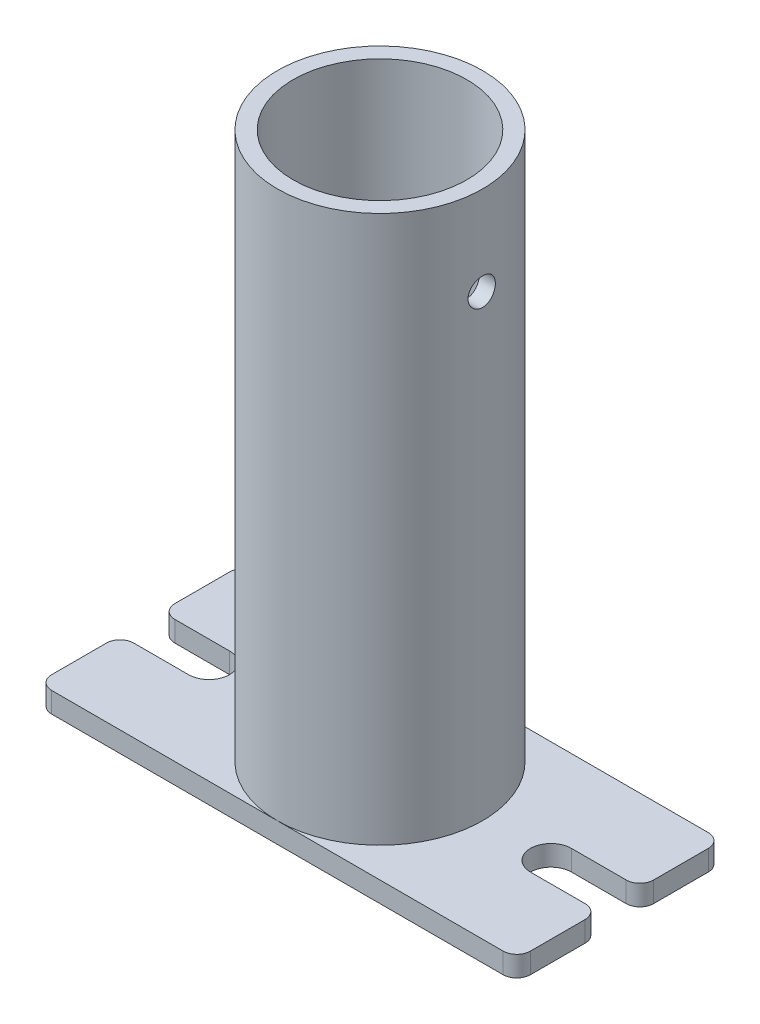
ISO-10303-21;
HEADER;
FILE_DESCRIPTION(('STEP AP214'),'2;1');
FILE_NAME('part.step','',(''),(''),'','','');
FILE_SCHEMA(('AUTOMOTIVE_DESIGN { 1 0 10303 214 1 1 1 1 }'));
ENDSEC;
DATA;
#1=APPLICATION_CONTEXT('core data for automotive mechanical design processes');
#2=APPLICATION_PROTOCOL_DEFINITION('international standard','automotive_design',2000,#1);
#3=PRODUCT_CONTEXT('',#1,'mechanical');
#4=PRODUCT('Part','Part','',(#3));
#5=PRODUCT_RELATED_PRODUCT_CATEGORY('part','',(#4));
#6=PRODUCT_DEFINITION_FORMATION('','',#4);
#7=PRODUCT_DEFINITION_CONTEXT('part definition',#1,'design');
#8=PRODUCT_DEFINITION('design','',#6,#7);
#9=PRODUCT_DEFINITION_SHAPE('','',#8);
#10=(LENGTH_UNIT() NAMED_UNIT(*) SI_UNIT(.MILLI.,.METRE.));
#11=(NAMED_UNIT(*) PLANE_ANGLE_UNIT() SI_UNIT($,.RADIAN.));
#12=(NAMED_UNIT(*) SI_UNIT($,.STERADIAN.) SOLID_ANGLE_UNIT());
#13=UNCERTAINTY_MEASURE_WITH_UNIT(LENGTH_MEASURE(1.E-05),#10,'distance_accuracy_value','');
#14=(GEOMETRIC_REPRESENTATION_CONTEXT(3) GLOBAL_UNCERTAINTY_ASSIGNED_CONTEXT((#13)) GLOBAL_UNIT_ASSIGNED_CONTEXT((#10,
#11,#12)) REPRESENTATION_CONTEXT('',''));
#15=CARTESIAN_POINT('',(0.,0.,0.));
#16=DIRECTION('',(0.,0.,1.));
#17=DIRECTION('',(1.,0.,0.));
#18=AXIS2_PLACEMENT_3D('',#15,#16,#17);
#19=CARTESIAN_POINT('',(10.,3.,-15.));
#20=DIRECTION('',(0.,1.,0.));
#21=DIRECTION('',(0.,0.,1.));
#22=AXIS2_PLACEMENT_3D('',#19,#20,#21);
#23=PLANE('',#22);
#24=CARTESIAN_POINT('',(35.,3.,-15.));
#25=DIRECTION('',(0.,1.,0.));
#26=DIRECTION('',(0.,0.,1.));
#27=AXIS2_PLACEMENT_3D('',#24,#25,#26);
#28=CIRCLE('',#27,15.);
#29=CARTESIAN_POINT('',(35.,3.,0.));
#30=VERTEX_POINT('',#29);
#31=CARTESIAN_POINT('',(35.,3.,-30.));
#32=VERTEX_POINT('',#31);
#33=EDGE_CURVE('E236',#30,#32,#28,.T.);
#34=ORIENTED_EDGE('',*,*,#33,.F.);
#35=DIRECTION('',(1.,0.,0.));
#36=VECTOR('',#35,1.);
#37=CARTESIAN_POINT('',(2.00000000000001,3.,0.));
#38=LINE('',#37,#36);
#39=CARTESIAN_POINT('',(68.,3.,0.));
#40=VERTEX_POINT('',#39);
#41=EDGE_CURVE('E509',#30,#40,#38,.T.);
#42=ORIENTED_EDGE('',*,*,#41,.T.);
#43=CARTESIAN_POINT('',(68.,3.,-2.));
#44=DIRECTION('',(0.,1.,0.));
#45=DIRECTION('',(0.,0.,1.));
#46=AXIS2_PLACEMENT_3D('',#43,#44,#45);
#47=CIRCLE('',#46,2.);
#48=CARTESIAN_POINT('',(70.,3.,-2.00000000000001));
#49=VERTEX_POINT('',#48);
#50=EDGE_CURVE('E520',#40,#49,#47,.T.);
#51=ORIENTED_EDGE('',*,*,#50,.T.);
#52=DIRECTION('',(0.,0.,-1.));
#53=VECTOR('',#52,1.);
#54=CARTESIAN_POINT('',(70.,3.,-2.00000000000001));
#55=LINE('',#54,#53);
#56=CARTESIAN_POINT('',(70.,3.,-9.99999999999999));
#57=VERTEX_POINT('',#56);
#58=EDGE_CURVE('E523',#49,#57,#55,.T.);
#59=ORIENTED_EDGE('',*,*,#58,.T.);
#60=CARTESIAN_POINT('',(68.,3.,-10.));
#61=DIRECTION('',(0.,1.,0.));
#62=DIRECTION('',(0.,0.,-1.));
#63=AXIS2_PLACEMENT_3D('',#60,#61,#62);
#64=CIRCLE('',#63,2.);
#65=CARTESIAN_POINT('',(68.,3.,-12.));
#66=VERTEX_POINT('',#65);
#67=EDGE_CURVE('E526',#57,#66,#64,.T.);
#68=ORIENTED_EDGE('',*,*,#67,.T.);
#69=DIRECTION('',(-1.,0.,0.));
#70=VECTOR('',#69,1.);
#71=CARTESIAN_POINT('',(68.,3.,-12.));
#72=LINE('',#71,#70);
#73=CARTESIAN_POINT('',(60.,3.,-12.));
#74=VERTEX_POINT('',#73);
#75=EDGE_CURVE('E529',#66,#74,#72,.T.);
#76=ORIENTED_EDGE('',*,*,#75,.T.);
#77=CARTESIAN_POINT('',(60.,3.,-15.));
#78=DIRECTION('',(0.,-1.,0.));
#79=DIRECTION('',(0.,0.,1.));
#80=AXIS2_PLACEMENT_3D('',#77,#78,#79);
#81=CIRCLE('',#80,3.);
#82=CARTESIAN_POINT('',(60.,3.,-18.));
#83=VERTEX_POINT('',#82);
#84=EDGE_CURVE('E532',#74,#83,#81,.T.);
#85=ORIENTED_EDGE('',*,*,#84,.T.);
#86=DIRECTION('',(1.,0.,0.));
#87=VECTOR('',#86,1.);
#88=CARTESIAN_POINT('',(68.,3.,-18.));
#89=LINE('',#88,#87);
#90=CARTESIAN_POINT('',(68.,3.,-18.));
#91=VERTEX_POINT('',#90);
#92=EDGE_CURVE('E535',#83,#91,#89,.T.);
#93=ORIENTED_EDGE('',*,*,#92,.T.);
#94=CARTESIAN_POINT('',(68.,3.,-20.));
#95=DIRECTION('',(0.,1.,0.));
#96=DIRECTION('',(0.,0.,1.));
#97=AXIS2_PLACEMENT_3D('',#94,#95,#96);
#98=CIRCLE('',#97,2.);
#99=CARTESIAN_POINT('',(70.,3.,-20.));
#100=VERTEX_POINT('',#99);
#101=EDGE_CURVE('E538',#91,#100,#98,.T.);
#102=ORIENTED_EDGE('',*,*,#101,.T.);
#103=DIRECTION('',(0.,0.,-1.));
#104=VECTOR('',#103,1.);
#105=CARTESIAN_POINT('',(70.,3.,-20.));
#106=LINE('',#105,#104);
#107=CARTESIAN_POINT('',(70.,3.,-28.));
#108=VERTEX_POINT('',#107);
#109=EDGE_CURVE('E541',#100,#108,#106,.T.);
#110=ORIENTED_EDGE('',*,*,#109,.T.);
#111=CARTESIAN_POINT('',(68.,3.,-28.));
#112=DIRECTION('',(0.,1.,0.));
#113=DIRECTION('',(0.,0.,-1.));
#114=AXIS2_PLACEMENT_3D('',#111,#112,#113);
#115=CIRCLE('',#114,2.);
#116=CARTESIAN_POINT('',(68.,3.,-30.));
#117=VERTEX_POINT('',#116);
#118=EDGE_CURVE('E544',#108,#117,#115,.T.);
#119=ORIENTED_EDGE('',*,*,#118,.T.);
#120=DIRECTION('',(-1.,0.,0.));
#121=VECTOR('',#120,1.);
#122=CARTESIAN_POINT('',(2.00000000000001,3.,-30.));
#123=LINE('',#122,#121);
#124=EDGE_CURVE('E548',#117,#32,#123,.T.);
#125=ORIENTED_EDGE('',*,*,#124,.T.);
#126=EDGE_LOOP('',(#34,#42,#51,#59,#68,#76,#85,#93,#102,#110,#119,#125));
#127=FACE_BOUND('',#126,.T.);
#128=ADVANCED_FACE('F43',(#127),#23,.T.);
#129=CARTESIAN_POINT('',(10.,3.,-15.));
#130=DIRECTION('',(0.,-1.,0.));
#131=DIRECTION('',(0.,0.,-1.));
#132=AXIS2_PLACEMENT_3D('',#129,#130,#131);
#133=CYLINDRICAL_SURFACE('',#132,3.);
#134=CARTESIAN_POINT('',(10.,0.,-15.));
#135=DIRECTION('',(0.,-1.,0.));
#136=DIRECTION('',(0.,0.,1.));
#137=AXIS2_PLACEMENT_3D('',#134,#135,#136);
#138=CIRCLE('',#137,3.);
#139=CARTESIAN_POINT('',(10.,0.,-18.));
#140=VERTEX_POINT('',#139);
#141=CARTESIAN_POINT('',(10.,0.,-12.));
#142=VERTEX_POINT('',#141);
#143=EDGE_CURVE('E231',#140,#142,#138,.T.);
#144=ORIENTED_EDGE('',*,*,#143,.T.);
#145=DIRECTION('',(0.,-1.,0.));
#146=VECTOR('',#145,1.);
#147=CARTESIAN_POINT('',(10.,3.,-12.));
#148=LINE('',#147,#146);
#149=CARTESIAN_POINT('',(10.,3.,-12.));
#150=VERTEX_POINT('',#149);
#151=EDGE_CURVE('E358',#150,#142,#148,.T.);
#152=ORIENTED_EDGE('',*,*,#151,.F.);
#153=CARTESIAN_POINT('',(10.,3.,-15.));
#154=DIRECTION('',(0.,-1.,0.));
#155=DIRECTION('',(0.,0.,1.));
#156=AXIS2_PLACEMENT_3D('',#153,#154,#155);
#157=CIRCLE('',#156,3.);
#158=CARTESIAN_POINT('',(10.,3.,-18.));
#159=VERTEX_POINT('',#158);
#160=EDGE_CURVE('E291',#159,#150,#157,.T.);
#161=ORIENTED_EDGE('',*,*,#160,.F.);
#162=DIRECTION('',(0.,-1.,0.));
#163=VECTOR('',#162,1.);
#164=CARTESIAN_POINT('',(10.,3.,-18.));
#165=LINE('',#164,#163);
#166=EDGE_CURVE('E227',#159,#140,#165,.T.);
#167=ORIENTED_EDGE('',*,*,#166,.T.);
#168=EDGE_LOOP('',(#144,#152,#161,#167));
#169=FACE_BOUND('',#168,.T.);
#170=ADVANCED_FACE('F45',(#169),#133,.F.);
#171=CARTESIAN_POINT('',(2.00000000000001,3.,-12.));
#172=DIRECTION('',(0.,0.,1.));
#173=DIRECTION('',(1.,0.,0.));
#174=AXIS2_PLACEMENT_3D('',#171,#172,#173);
#175=PLANE('',#174);
#176=DIRECTION('',(-1.,0.,0.));
#177=VECTOR('',#176,1.);
#178=CARTESIAN_POINT('',(2.00000000000001,0.,-12.));
#179=LINE('',#178,#177);
#180=CARTESIAN_POINT('',(2.00000000000001,0.,-12.));
#181=VERTEX_POINT('',#180);
#182=EDGE_CURVE('E235',#142,#181,#179,.T.);
#183=ORIENTED_EDGE('',*,*,#182,.T.);
#184=DIRECTION('',(0.,-1.,0.));
#185=VECTOR('',#184,1.);
#186=CARTESIAN_POINT('',(2.00000000000001,3.,-12.));
#187=LINE('',#186,#185);
#188=CARTESIAN_POINT('',(2.00000000000001,3.,-12.));
#189=VERTEX_POINT('',#188);
#190=EDGE_CURVE('E354',#189,#181,#187,.T.);
#191=ORIENTED_EDGE('',*,*,#190,.F.);
#192=DIRECTION('',(-1.,0.,0.));
#193=VECTOR('',#192,1.);
#194=CARTESIAN_POINT('',(2.00000000000001,3.,-12.));
#195=LINE('',#194,#193);
#196=EDGE_CURVE('E150',#150,#189,#195,.T.);
#197=ORIENTED_EDGE('',*,*,#196,.F.);
#198=ORIENTED_EDGE('',*,*,#151,.T.);
#199=EDGE_LOOP('',(#183,#191,#197,#198));
#200=FACE_BOUND('',#199,.T.);
#201=ADVANCED_FACE('F413',(#200),#175,.F.);
#202=CARTESIAN_POINT('',(2.,3.,-10.));
#203=DIRECTION('',(0.,-1.,0.));
#204=DIRECTION('',(0.,0.,-1.));
#205=AXIS2_PLACEMENT_3D('',#202,#203,#204);
#206=CYLINDRICAL_SURFACE('',#205,2.);
#207=CARTESIAN_POINT('',(2.,0.,-10.));
#208=DIRECTION('',(0.,1.,0.));
#209=DIRECTION('',(0.,0.,1.));
#210=AXIS2_PLACEMENT_3D('',#207,#208,#209);
#211=CIRCLE('',#210,2.);
#212=CARTESIAN_POINT('',(0.,0.,-9.99999999999999));
#213=VERTEX_POINT('',#212);
#214=EDGE_CURVE('E239',#181,#213,#211,.T.);
#215=ORIENTED_EDGE('',*,*,#214,.T.);
#216=DIRECTION('',(0.,-1.,0.));
#217=VECTOR('',#216,1.);
#218=CARTESIAN_POINT('',(0.,3.,-9.99999999999999));
#219=LINE('',#218,#217);
#220=CARTESIAN_POINT('',(0.,3.,-9.99999999999999));
#221=VERTEX_POINT('',#220);
#222=EDGE_CURVE('E350',#221,#213,#219,.T.);
#223=ORIENTED_EDGE('',*,*,#222,.F.);
#224=CARTESIAN_POINT('',(2.,3.,-10.));
#225=DIRECTION('',(0.,1.,0.));
#226=DIRECTION('',(0.,0.,1.));
#227=AXIS2_PLACEMENT_3D('',#224,#225,#226);
#228=CIRCLE('',#227,2.);
#229=EDGE_CURVE('E498',#189,#221,#228,.T.);
#230=ORIENTED_EDGE('',*,*,#229,.F.);
#231=ORIENTED_EDGE('',*,*,#190,.T.);
#232=EDGE_LOOP('',(#215,#223,#230,#231));
#233=FACE_BOUND('',#232,.T.);
#234=ADVANCED_FACE('F487',(#233),#206,.T.);
#235=CARTESIAN_POINT('',(0.,3.,-2.00000000000001));
#236=DIRECTION('',(1.,0.,0.));
#237=DIRECTION('',(0.,0.,-1.));
#238=AXIS2_PLACEMENT_3D('',#235,#236,#237);
#239=PLANE('',#238);
#240=DIRECTION('',(0.,0.,1.));
#241=VECTOR('',#240,1.);
#242=CARTESIAN_POINT('',(0.,0.,-2.00000000000001));
#243=LINE('',#242,#241);
#244=CARTESIAN_POINT('',(0.,0.,-2.00000000000001));
#245=VERTEX_POINT('',#244);
#246=EDGE_CURVE('E242',#213,#245,#243,.T.);
#247=ORIENTED_EDGE('',*,*,#246,.T.);
#248=DIRECTION('',(0.,-1.,0.));
#249=VECTOR('',#248,1.);
#250=CARTESIAN_POINT('',(0.,3.,-2.00000000000001));
#251=LINE('',#250,#249);
#252=CARTESIAN_POINT('',(0.,3.,-2.00000000000001));
#253=VERTEX_POINT('',#252);
#254=EDGE_CURVE('E346',#253,#245,#251,.T.);
#255=ORIENTED_EDGE('',*,*,#254,.F.);
#256=DIRECTION('',(0.,0.,1.));
#257=VECTOR('',#256,1.);
#258=CARTESIAN_POINT('',(0.,3.,-2.00000000000001));
#259=LINE('',#258,#257);
#260=EDGE_CURVE('E510',#221,#253,#259,.T.);
#261=ORIENTED_EDGE('',*,*,#260,.F.);
#262=ORIENTED_EDGE('',*,*,#222,.T.);
#263=EDGE_LOOP('',(#247,#255,#261,#262));
#264=FACE_BOUND('',#263,.T.);
#265=ADVANCED_FACE('F483',(#264),#239,.F.);
#266=CARTESIAN_POINT('',(2.,3.,-2.));
#267=DIRECTION('',(0.,-1.,0.));
#268=DIRECTION('',(0.,0.,-1.));
#269=AXIS2_PLACEMENT_3D('',#266,#267,#268);
#270=CYLINDRICAL_SURFACE('',#269,2.);
#271=CARTESIAN_POINT('',(2.,0.,-2.));
#272=DIRECTION('',(0.,1.,0.));
#273=DIRECTION('',(0.,0.,-1.));
#274=AXIS2_PLACEMENT_3D('',#271,#272,#273);
#275=CIRCLE('',#274,2.);
#276=CARTESIAN_POINT('',(2.00000000000001,0.,0.));
#277=VERTEX_POINT('',#276);
#278=EDGE_CURVE('E245',#245,#277,#275,.T.);
#279=ORIENTED_EDGE('',*,*,#278,.T.);
#280=DIRECTION('',(0.,-1.,0.));
#281=VECTOR('',#280,1.);
#282=CARTESIAN_POINT('',(2.00000000000001,3.,0.));
#283=LINE('',#282,#281);
#284=CARTESIAN_POINT('',(2.00000000000001,3.,0.));
#285=VERTEX_POINT('',#284);
#286=EDGE_CURVE('E342',#285,#277,#283,.T.);
#287=ORIENTED_EDGE('',*,*,#286,.F.);
#288=CARTESIAN_POINT('',(2.,3.,-2.));
#289=DIRECTION('',(0.,1.,0.));
#290=DIRECTION('',(0.,0.,-1.));
#291=AXIS2_PLACEMENT_3D('',#288,#289,#290);
#292=CIRCLE('',#291,2.);
#293=EDGE_CURVE('E506',#253,#285,#292,.T.);
#294=ORIENTED_EDGE('',*,*,#293,.F.);
#295=ORIENTED_EDGE('',*,*,#254,.T.);
#296=EDGE_LOOP('',(#279,#287,#294,#295));
#297=FACE_BOUND('',#296,.T.);
#298=ADVANCED_FACE('F479',(#297),#270,.T.);
#299=CARTESIAN_POINT('',(2.00000000000001,3.,0.));
#300=DIRECTION('',(0.,0.,-1.));
#301=DIRECTION('',(-1.,0.,0.));
#302=AXIS2_PLACEMENT_3D('',#299,#300,#301);
#303=PLANE('',#302);
#304=DIRECTION('',(1.,0.,0.));
#305=VECTOR('',#304,1.);
#306=CARTESIAN_POINT('',(2.00000000000001,0.,0.));
#307=LINE('',#306,#305);
#308=CARTESIAN_POINT('',(68.,0.,0.));
#309=VERTEX_POINT('',#308);
#310=EDGE_CURVE('E248',#277,#309,#307,.T.);
#311=ORIENTED_EDGE('',*,*,#310,.T.);
#312=DIRECTION('',(0.,-1.,0.));
#313=VECTOR('',#312,1.);
#314=CARTESIAN_POINT('',(68.,3.,0.));
#315=LINE('',#314,#313);
#316=EDGE_CURVE('E338',#40,#309,#315,.T.);
#317=ORIENTED_EDGE('',*,*,#316,.F.);
#318=ORIENTED_EDGE('',*,*,#41,.F.);
#319=EDGE_CURVE('E514',#285,#30,#38,.T.);
#320=ORIENTED_EDGE('',*,*,#319,.F.);
#321=ORIENTED_EDGE('',*,*,#286,.T.);
#322=EDGE_LOOP('',(#311,#317,#318,#320,#321));
#323=FACE_BOUND('',#322,.T.);
#324=ADVANCED_FACE('F475',(#323),#303,.F.);
#325=CARTESIAN_POINT('',(68.,3.,-2.));
#326=DIRECTION('',(0.,-1.,0.));
#327=DIRECTION('',(0.,0.,-1.));
#328=AXIS2_PLACEMENT_3D('',#325,#326,#327);
#329=CYLINDRICAL_SURFACE('',#328,2.);
#330=CARTESIAN_POINT('',(68.,0.,-2.));
#331=DIRECTION('',(0.,1.,0.));
#332=DIRECTION('',(0.,0.,1.));
#333=AXIS2_PLACEMENT_3D('',#330,#331,#332);
#334=CIRCLE('',#333,2.);
#335=CARTESIAN_POINT('',(70.,0.,-2.00000000000001));
#336=VERTEX_POINT('',#335);
#337=EDGE_CURVE('E251',#309,#336,#334,.T.);
#338=ORIENTED_EDGE('',*,*,#337,.T.);
#339=DIRECTION('',(0.,-1.,0.));
#340=VECTOR('',#339,1.);
#341=CARTESIAN_POINT('',(70.,3.,-2.00000000000001));
#342=LINE('',#341,#340);
#343=EDGE_CURVE('E334',#49,#336,#342,.T.);
#344=ORIENTED_EDGE('',*,*,#343,.F.);
#345=ORIENTED_EDGE('',*,*,#50,.F.);
#346=ORIENTED_EDGE('',*,*,#316,.T.);
#347=EDGE_LOOP('',(#338,#344,#345,#346));
#348=FACE_BOUND('',#347,.T.);
#349=ADVANCED_FACE('F471',(#348),#329,.T.);
#350=CARTESIAN_POINT('',(70.,3.,-2.00000000000001));
#351=DIRECTION('',(-1.,0.,0.));
#352=DIRECTION('',(0.,0.,1.));
#353=AXIS2_PLACEMENT_3D('',#350,#351,#352);
#354=PLANE('',#353);
#355=DIRECTION('',(0.,0.,-1.));
#356=VECTOR('',#355,1.);
#357=CARTESIAN_POINT('',(70.,0.,-2.00000000000001));
#358=LINE('',#357,#356);
#359=CARTESIAN_POINT('',(70.,0.,-9.99999999999999));
#360=VERTEX_POINT('',#359);
#361=EDGE_CURVE('E254',#336,#360,#358,.T.);
#362=ORIENTED_EDGE('',*,*,#361,.T.);
#363=DIRECTION('',(0.,-1.,0.));
#364=VECTOR('',#363,1.);
#365=CARTESIAN_POINT('',(70.,3.,-9.99999999999999));
#366=LINE('',#365,#364);
#367=EDGE_CURVE('E330',#57,#360,#366,.T.);
#368=ORIENTED_EDGE('',*,*,#367,.F.);
#369=ORIENTED_EDGE('',*,*,#58,.F.);
#370=ORIENTED_EDGE('',*,*,#343,.T.);
#371=EDGE_LOOP('',(#362,#368,#369,#370));
#372=FACE_BOUND('',#371,.T.);
#373=ADVANCED_FACE('F467',(#372),#354,.F.);
#374=CARTESIAN_POINT('',(68.,3.,-10.));
#375=DIRECTION('',(0.,-1.,0.));
#376=DIRECTION('',(0.,0.,-1.));
#377=AXIS2_PLACEMENT_3D('',#374,#375,#376);
#378=CYLINDRICAL_SURFACE('',#377,2.);
#379=CARTESIAN_POINT('',(68.,0.,-10.));
#380=DIRECTION('',(0.,1.,0.));
#381=DIRECTION('',(0.,0.,-1.));
#382=AXIS2_PLACEMENT_3D('',#379,#380,#381);
#383=CIRCLE('',#382,2.);
#384=CARTESIAN_POINT('',(68.,0.,-12.));
#385=VERTEX_POINT('',#384);
#386=EDGE_CURVE('E257',#360,#385,#383,.T.);
#387=ORIENTED_EDGE('',*,*,#386,.T.);
#388=DIRECTION('',(0.,-1.,0.));
#389=VECTOR('',#388,1.);
#390=CARTESIAN_POINT('',(68.,3.,-12.));
#391=LINE('',#390,#389);
#392=EDGE_CURVE('E326',#66,#385,#391,.T.);
#393=ORIENTED_EDGE('',*,*,#392,.F.);
#394=ORIENTED_EDGE('',*,*,#67,.F.);
#395=ORIENTED_EDGE('',*,*,#367,.T.);
#396=EDGE_LOOP('',(#387,#393,#394,#395));
#397=FACE_BOUND('',#396,.T.);
#398=ADVANCED_FACE('F463',(#397),#378,.T.);
#399=CARTESIAN_POINT('',(68.,3.,-12.));
#400=DIRECTION('',(0.,0.,1.));
#401=DIRECTION('',(1.,0.,0.));
#402=AXIS2_PLACEMENT_3D('',#399,#400,#401);
#403=PLANE('',#402);
#404=DIRECTION('',(-1.,0.,0.));
#405=VECTOR('',#404,1.);
#406=CARTESIAN_POINT('',(68.,0.,-12.));
#407=LINE('',#406,#405);
#408=CARTESIAN_POINT('',(60.,0.,-12.));
#409=VERTEX_POINT('',#408);
#410=EDGE_CURVE('E260',#385,#409,#407,.T.);
#411=ORIENTED_EDGE('',*,*,#410,.T.);
#412=DIRECTION('',(0.,-1.,0.));
#413=VECTOR('',#412,1.);
#414=CARTESIAN_POINT('',(60.,3.,-12.));
#415=LINE('',#414,#413);
#416=EDGE_CURVE('E322',#74,#409,#415,.T.);
#417=ORIENTED_EDGE('',*,*,#416,.F.);
#418=ORIENTED_EDGE('',*,*,#75,.F.);
#419=ORIENTED_EDGE('',*,*,#392,.T.);
#420=EDGE_LOOP('',(#411,#417,#418,#419));
#421=FACE_BOUND('',#420,.T.);
#422=ADVANCED_FACE('F459',(#421),#403,.F.);
#423=CARTESIAN_POINT('',(60.,3.,-15.));
#424=DIRECTION('',(0.,-1.,0.));
#425=DIRECTION('',(0.,0.,-1.));
#426=AXIS2_PLACEMENT_3D('',#423,#424,#425);
#427=CYLINDRICAL_SURFACE('',#426,3.);
#428=CARTESIAN_POINT('',(60.,0.,-15.));
#429=DIRECTION('',(0.,-1.,0.));
#430=DIRECTION('',(0.,0.,1.));
#431=AXIS2_PLACEMENT_3D('',#428,#429,#430);
#432=CIRCLE('',#431,3.);
#433=CARTESIAN_POINT('',(60.,0.,-18.));
#434=VERTEX_POINT('',#433);
#435=EDGE_CURVE('E263',#409,#434,#432,.T.);
#436=ORIENTED_EDGE('',*,*,#435,.T.);
#437=DIRECTION('',(0.,-1.,0.));
#438=VECTOR('',#437,1.);
#439=CARTESIAN_POINT('',(60.,3.,-18.));
#440=LINE('',#439,#438);
#441=EDGE_CURVE('E318',#83,#434,#440,.T.);
#442=ORIENTED_EDGE('',*,*,#441,.F.);
#443=ORIENTED_EDGE('',*,*,#84,.F.);
#444=ORIENTED_EDGE('',*,*,#416,.T.);
#445=EDGE_LOOP('',(#436,#442,#443,#444));
#446=FACE_BOUND('',#445,.T.);
#447=ADVANCED_FACE('F455',(#446),#427,.F.);
#448=CARTESIAN_POINT('',(68.,3.,-18.));
#449=DIRECTION('',(0.,0.,-1.));
#450=DIRECTION('',(-1.,0.,0.));
#451=AXIS2_PLACEMENT_3D('',#448,#449,#450);
#452=PLANE('',#451);
#453=DIRECTION('',(1.,0.,0.));
#454=VECTOR('',#453,1.);
#455=CARTESIAN_POINT('',(68.,0.,-18.));
#456=LINE('',#455,#454);
#457=CARTESIAN_POINT('',(68.,0.,-18.));
#458=VERTEX_POINT('',#457);
#459=EDGE_CURVE('E266',#434,#458,#456,.T.);
#460=ORIENTED_EDGE('',*,*,#459,.T.);
#461=DIRECTION('',(0.,-1.,0.));
#462=VECTOR('',#461,1.);
#463=CARTESIAN_POINT('',(68.,3.,-18.));
#464=LINE('',#463,#462);
#465=EDGE_CURVE('E314',#91,#458,#464,.T.);
#466=ORIENTED_EDGE('',*,*,#465,.F.);
#467=ORIENTED_EDGE('',*,*,#92,.F.);
#468=ORIENTED_EDGE('',*,*,#441,.T.);
#469=EDGE_LOOP('',(#460,#466,#467,#468));
#470=FACE_BOUND('',#469,.T.);
#471=ADVANCED_FACE('F451',(#470),#452,.F.);
#472=CARTESIAN_POINT('',(68.,3.,-20.));
#473=DIRECTION('',(0.,-1.,0.));
#474=DIRECTION('',(0.,0.,-1.));
#475=AXIS2_PLACEMENT_3D('',#472,#473,#474);
#476=CYLINDRICAL_SURFACE('',#475,2.);
#477=CARTESIAN_POINT('',(68.,0.,-20.));
#478=DIRECTION('',(0.,1.,0.));
#479=DIRECTION('',(0.,0.,1.));
#480=AXIS2_PLACEMENT_3D('',#477,#478,#479);
#481=CIRCLE('',#480,2.);
#482=CARTESIAN_POINT('',(70.,0.,-20.));
#483=VERTEX_POINT('',#482);
#484=EDGE_CURVE('E269',#458,#483,#481,.T.);
#485=ORIENTED_EDGE('',*,*,#484,.T.);
#486=DIRECTION('',(0.,-1.,0.));
#487=VECTOR('',#486,1.);
#488=CARTESIAN_POINT('',(70.,3.,-20.));
#489=LINE('',#488,#487);
#490=EDGE_CURVE('E310',#100,#483,#489,.T.);
#491=ORIENTED_EDGE('',*,*,#490,.F.);
#492=ORIENTED_EDGE('',*,*,#101,.F.);
#493=ORIENTED_EDGE('',*,*,#465,.T.);
#494=EDGE_LOOP('',(#485,#491,#492,#493));
#495=FACE_BOUND('',#494,.T.);
#496=ADVANCED_FACE('F447',(#495),#476,.T.);
#497=CARTESIAN_POINT('',(70.,3.,-20.));
#498=DIRECTION('',(-1.,0.,0.));
#499=DIRECTION('',(0.,0.,1.));
#500=AXIS2_PLACEMENT_3D('',#497,#498,#499);
#501=PLANE('',#500);
#502=DIRECTION('',(0.,0.,-1.));
#503=VECTOR('',#502,1.);
#504=CARTESIAN_POINT('',(70.,0.,-20.));
#505=LINE('',#504,#503);
#506=CARTESIAN_POINT('',(70.,0.,-28.));
#507=VERTEX_POINT('',#506);
#508=EDGE_CURVE('E272',#483,#507,#505,.T.);
#509=ORIENTED_EDGE('',*,*,#508,.T.);
#510=DIRECTION('',(0.,-1.,0.));
#511=VECTOR('',#510,1.);
#512=CARTESIAN_POINT('',(70.,3.,-28.));
#513=LINE('',#512,#511);
#514=EDGE_CURVE('E306',#108,#507,#513,.T.);
#515=ORIENTED_EDGE('',*,*,#514,.F.);
#516=ORIENTED_EDGE('',*,*,#109,.F.);
#517=ORIENTED_EDGE('',*,*,#490,.T.);
#518=EDGE_LOOP('',(#509,#515,#516,#517));
#519=FACE_BOUND('',#518,.T.);
#520=ADVANCED_FACE('F443',(#519),#501,.F.);
#521=CARTESIAN_POINT('',(68.,3.,-28.));
#522=DIRECTION('',(0.,-1.,0.));
#523=DIRECTION('',(0.,0.,-1.));
#524=AXIS2_PLACEMENT_3D('',#521,#522,#523);
#525=CYLINDRICAL_SURFACE('',#524,2.);
#526=CARTESIAN_POINT('',(68.,0.,-28.));
#527=DIRECTION('',(0.,1.,0.));
#528=DIRECTION('',(0.,0.,-1.));
#529=AXIS2_PLACEMENT_3D('',#526,#527,#528);
#530=CIRCLE('',#529,2.);
#531=CARTESIAN_POINT('',(68.,0.,-30.));
#532=VERTEX_POINT('',#531);
#533=EDGE_CURVE('E275',#507,#532,#530,.T.);
#534=ORIENTED_EDGE('',*,*,#533,.T.);
#535=DIRECTION('',(0.,-1.,0.));
#536=VECTOR('',#535,1.);
#537=CARTESIAN_POINT('',(68.,3.,-30.));
#538=LINE('',#537,#536);
#539=EDGE_CURVE('E302',#117,#532,#538,.T.);
#540=ORIENTED_EDGE('',*,*,#539,.F.);
#541=ORIENTED_EDGE('',*,*,#118,.F.);
#542=ORIENTED_EDGE('',*,*,#514,.T.);
#543=EDGE_LOOP('',(#534,#540,#541,#542));
#544=FACE_BOUND('',#543,.T.);
#545=ADVANCED_FACE('F439',(#544),#525,.T.);
#546=CARTESIAN_POINT('',(2.00000000000001,3.,-30.));
#547=DIRECTION('',(0.,0.,1.));
#548=DIRECTION('',(1.,0.,0.));
#549=AXIS2_PLACEMENT_3D('',#546,#547,#548);
#550=PLANE('',#549);
#551=DIRECTION('',(-1.,0.,0.));
#552=VECTOR('',#551,1.);
#553=CARTESIAN_POINT('',(2.00000000000001,0.,-30.));
#554=LINE('',#553,#552);
#555=CARTESIAN_POINT('',(2.,0.,-30.));
#556=VERTEX_POINT('',#555);
#557=EDGE_CURVE('E278',#532,#556,#554,.T.);
#558=ORIENTED_EDGE('',*,*,#557,.T.);
#559=DIRECTION('',(0.,-1.,0.));
#560=VECTOR('',#559,1.);
#561=CARTESIAN_POINT('',(2.,3.,-30.));
#562=LINE('',#561,#560);
#563=CARTESIAN_POINT('',(2.,3.,-30.));
#564=VERTEX_POINT('',#563);
#565=EDGE_CURVE('E298',#564,#556,#562,.T.);
#566=ORIENTED_EDGE('',*,*,#565,.F.);
#567=EDGE_CURVE('E547',#32,#564,#123,.T.);
#568=ORIENTED_EDGE('',*,*,#567,.F.);
#569=ORIENTED_EDGE('',*,*,#124,.F.);
#570=ORIENTED_EDGE('',*,*,#539,.T.);
#571=EDGE_LOOP('',(#558,#566,#568,#569,#570));
#572=FACE_BOUND('',#571,.T.);
#573=ADVANCED_FACE('F435',(#572),#550,.F.);
#574=CARTESIAN_POINT('',(2.,3.,-28.));
#575=DIRECTION('',(0.,-1.,0.));
#576=DIRECTION('',(0.,0.,-1.));
#577=AXIS2_PLACEMENT_3D('',#574,#575,#576);
#578=CYLINDRICAL_SURFACE('',#577,2.);
#579=CARTESIAN_POINT('',(2.,0.,-28.));
#580=DIRECTION('',(0.,1.,0.));
#581=DIRECTION('',(0.,0.,-1.));
#582=AXIS2_PLACEMENT_3D('',#579,#580,#581);
#583=CIRCLE('',#582,2.);
#584=CARTESIAN_POINT('',(0.,0.,-28.));
#585=VERTEX_POINT('',#584);
#586=EDGE_CURVE('E281',#556,#585,#583,.T.);
#587=ORIENTED_EDGE('',*,*,#586,.T.);
#588=DIRECTION('',(0.,-1.,0.));
#589=VECTOR('',#588,1.);
#590=CARTESIAN_POINT('',(0.,3.,-28.));
#591=LINE('',#590,#589);
#592=CARTESIAN_POINT('',(0.,3.,-28.));
#593=VERTEX_POINT('',#592);
#594=EDGE_CURVE('E220',#593,#585,#591,.T.);
#595=ORIENTED_EDGE('',*,*,#594,.F.);
#596=CARTESIAN_POINT('',(2.,3.,-28.));
#597=DIRECTION('',(0.,1.,0.));
#598=DIRECTION('',(0.,0.,-1.));
#599=AXIS2_PLACEMENT_3D('',#596,#597,#598);
#600=CIRCLE('',#599,2.);
#601=EDGE_CURVE('E206',#564,#593,#600,.T.);
#602=ORIENTED_EDGE('',*,*,#601,.F.);
#603=ORIENTED_EDGE('',*,*,#565,.T.);
#604=EDGE_LOOP('',(#587,#595,#602,#603));
#605=FACE_BOUND('',#604,.T.);
#606=ADVANCED_FACE('F432',(#605),#578,.T.);
#607=CARTESIAN_POINT('',(0.,3.,-20.));
#608=DIRECTION('',(1.,0.,0.));
#609=DIRECTION('',(0.,0.,-1.));
#610=AXIS2_PLACEMENT_3D('',#607,#608,#609);
#611=PLANE('',#610);
#612=DIRECTION('',(0.,0.,1.));
#613=VECTOR('',#612,1.);
#614=CARTESIAN_POINT('',(0.,0.,-20.));
#615=LINE('',#614,#613);
#616=CARTESIAN_POINT('',(0.,0.,-20.));
#617=VERTEX_POINT('',#616);
#618=EDGE_CURVE('E216',#585,#617,#615,.T.);
#619=ORIENTED_EDGE('',*,*,#618,.T.);
#620=DIRECTION('',(0.,-1.,0.));
#621=VECTOR('',#620,1.);
#622=CARTESIAN_POINT('',(0.,3.,-20.));
#623=LINE('',#622,#621);
#624=CARTESIAN_POINT('',(0.,3.,-20.));
#625=VERTEX_POINT('',#624);
#626=EDGE_CURVE('E213',#625,#617,#623,.T.);
#627=ORIENTED_EDGE('',*,*,#626,.F.);
#628=DIRECTION('',(0.,0.,1.));
#629=VECTOR('',#628,1.);
#630=CARTESIAN_POINT('',(0.,3.,-20.));
#631=LINE('',#630,#629);
#632=EDGE_CURVE('E199',#593,#625,#631,.T.);
#633=ORIENTED_EDGE('',*,*,#632,.F.);
#634=ORIENTED_EDGE('',*,*,#594,.T.);
#635=EDGE_LOOP('',(#619,#627,#633,#634));
#636=FACE_BOUND('',#635,.T.);
#637=ADVANCED_FACE('F214',(#636),#611,.F.);
#638=CARTESIAN_POINT('',(2.,3.,-20.));
#639=DIRECTION('',(0.,-1.,0.));
#640=DIRECTION('',(0.,0.,-1.));
#641=AXIS2_PLACEMENT_3D('',#638,#639,#640);
#642=CYLINDRICAL_SURFACE('',#641,2.);
#643=CARTESIAN_POINT('',(2.,0.,-20.));
#644=DIRECTION('',(0.,1.,0.));
#645=DIRECTION('',(0.,0.,-1.));
#646=AXIS2_PLACEMENT_3D('',#643,#644,#645);
#647=CIRCLE('',#646,2.);
#648=CARTESIAN_POINT('',(2.00000000000001,0.,-18.));
#649=VERTEX_POINT('',#648);
#650=EDGE_CURVE('E286',#617,#649,#647,.T.);
#651=ORIENTED_EDGE('',*,*,#650,.T.);
#652=DIRECTION('',(0.,-1.,0.));
#653=VECTOR('',#652,1.);
#654=CARTESIAN_POINT('',(2.00000000000001,3.,-18.));
#655=LINE('',#654,#653);
#656=CARTESIAN_POINT('',(2.00000000000001,3.,-18.));
#657=VERTEX_POINT('',#656);
#658=EDGE_CURVE('E221',#657,#649,#655,.T.);
#659=ORIENTED_EDGE('',*,*,#658,.F.);
#660=CARTESIAN_POINT('',(2.,3.,-20.));
#661=DIRECTION('',(0.,1.,0.));
#662=DIRECTION('',(0.,0.,-1.));
#663=AXIS2_PLACEMENT_3D('',#660,#661,#662);
#664=CIRCLE('',#663,2.);
#665=EDGE_CURVE('E203',#625,#657,#664,.T.);
#666=ORIENTED_EDGE('',*,*,#665,.F.);
#667=ORIENTED_EDGE('',*,*,#626,.T.);
#668=EDGE_LOOP('',(#651,#659,#666,#667));
#669=FACE_BOUND('',#668,.T.);
#670=ADVANCED_FACE('F223',(#669),#642,.T.);
#671=CARTESIAN_POINT('',(2.00000000000001,3.,-18.));
#672=DIRECTION('',(0.,0.,-1.));
#673=DIRECTION('',(-1.,0.,0.));
#674=AXIS2_PLACEMENT_3D('',#671,#672,#673);
#675=PLANE('',#674);
#676=DIRECTION('',(1.,0.,0.));
#677=VECTOR('',#676,1.);
#678=CARTESIAN_POINT('',(2.00000000000001,0.,-18.));
#679=LINE('',#678,#677);
#680=EDGE_CURVE('E141',#649,#140,#679,.T.);
#681=ORIENTED_EDGE('',*,*,#680,.T.);
#682=ORIENTED_EDGE('',*,*,#166,.F.);
#683=DIRECTION('',(1.,0.,0.));
#684=VECTOR('',#683,1.);
#685=CARTESIAN_POINT('',(2.00000000000001,3.,-18.));
#686=LINE('',#685,#684);
#687=EDGE_CURVE('E72',#657,#159,#686,.T.);
#688=ORIENTED_EDGE('',*,*,#687,.F.);
#689=ORIENTED_EDGE('',*,*,#658,.T.);
#690=EDGE_LOOP('',(#681,#682,#688,#689));
#691=FACE_BOUND('',#690,.T.);
#692=ADVANCED_FACE('F418',(#691),#675,.F.);
#693=EDGE_CURVE('E58',#32,#30,#28,.T.);
#694=ORIENTED_EDGE('',*,*,#693,.F.);
#695=ORIENTED_EDGE('',*,*,#567,.T.);
#696=ORIENTED_EDGE('',*,*,#601,.T.);
#697=ORIENTED_EDGE('',*,*,#632,.T.);
#698=ORIENTED_EDGE('',*,*,#665,.T.);
#699=ORIENTED_EDGE('',*,*,#687,.T.);
#700=ORIENTED_EDGE('',*,*,#160,.T.);
#701=ORIENTED_EDGE('',*,*,#196,.T.);
#702=ORIENTED_EDGE('',*,*,#229,.T.);
#703=ORIENTED_EDGE('',*,*,#260,.T.);
#704=ORIENTED_EDGE('',*,*,#293,.T.);
#705=ORIENTED_EDGE('',*,*,#319,.T.);
#706=EDGE_LOOP('',(#694,#695,#696,#697,#698,#699,#700,#701,#702,#703,#704,#705));
#707=FACE_BOUND('',#706,.T.);
#708=ADVANCED_FACE('F201',(#707),#23,.T.);
#709=CARTESIAN_POINT('',(10.,0.,-15.));
#710=DIRECTION('',(0.,1.,0.));
#711=DIRECTION('',(0.,0.,1.));
#712=AXIS2_PLACEMENT_3D('',#709,#710,#711);
#713=PLANE('',#712);
#714=ORIENTED_EDGE('',*,*,#143,.F.);
#715=ORIENTED_EDGE('',*,*,#680,.F.);
#716=ORIENTED_EDGE('',*,*,#650,.F.);
#717=ORIENTED_EDGE('',*,*,#618,.F.);
#718=ORIENTED_EDGE('',*,*,#586,.F.);
#719=ORIENTED_EDGE('',*,*,#557,.F.);
#720=ORIENTED_EDGE('',*,*,#533,.F.);
#721=ORIENTED_EDGE('',*,*,#508,.F.);
#722=ORIENTED_EDGE('',*,*,#484,.F.);
#723=ORIENTED_EDGE('',*,*,#459,.F.);
#724=ORIENTED_EDGE('',*,*,#435,.F.);
#725=ORIENTED_EDGE('',*,*,#410,.F.);
#726=ORIENTED_EDGE('',*,*,#386,.F.);
#727=ORIENTED_EDGE('',*,*,#361,.F.);
#728=ORIENTED_EDGE('',*,*,#337,.F.);
#729=ORIENTED_EDGE('',*,*,#310,.F.);
#730=ORIENTED_EDGE('',*,*,#278,.F.);
#731=ORIENTED_EDGE('',*,*,#246,.F.);
#732=ORIENTED_EDGE('',*,*,#214,.F.);
#733=ORIENTED_EDGE('',*,*,#182,.F.);
#734=EDGE_LOOP('',(#714,#715,#716,#717,#718,#719,#720,#721,#722,#723,#724,#725,#726,#727,#728,
#729,#730,#731,#732,#733));
#735=FACE_BOUND('',#734,.T.);
#736=ADVANCED_FACE('F417',(#735),#713,.F.);
#737=CARTESIAN_POINT('',(35.,8.,-15.));
#738=DIRECTION('',(0.,-1.,0.));
#739=DIRECTION('',(0.,0.,-1.));
#740=AXIS2_PLACEMENT_3D('',#737,#738,#739);
#741=CYLINDRICAL_SURFACE('',#740,15.);
#742=CARTESIAN_POINT('',(49.8660687473185,70.,-17.));
#743=CARTESIAN_POINT('',(49.8660704451043,69.8881961445325,-16.9999952859476));
#744=CARTESIAN_POINT('',(49.8673436464034,69.7763239668838,-16.9905932670413));
#745=CARTESIAN_POINT('',(49.8722964859732,69.5556975376641,-16.9532379626613));
#746=CARTESIAN_POINT('',(49.8759785863295,69.4469465950828,-16.9252656964911));
#747=CARTESIAN_POINT('',(49.8853249214529,69.2357886317737,-16.8516131114026));
#748=CARTESIAN_POINT('',(49.8909877556206,69.1333771883823,-16.8059453027504));
#749=CARTESIAN_POINT('',(49.9036558225185,68.9376889242904,-16.6982256488069));
#750=CARTESIAN_POINT('',(49.9106608397868,68.844410641062,-16.6361764326347));
#751=CARTESIAN_POINT('',(49.9252737732073,68.6690265453315,-16.4970337048952));
#752=CARTESIAN_POINT('',(49.9328848849373,68.5869871343206,-16.4198568227486));
#753=CARTESIAN_POINT('',(49.9478237625824,68.4369837545436,-16.2528292287261));
#754=CARTESIAN_POINT('',(49.9551515139324,68.3690205085238,-16.162977866472));
#755=CARTESIAN_POINT('',(49.9687309976037,68.2488581582836,-15.9727317249276));
#756=CARTESIAN_POINT('',(49.9749785650228,68.1967195107098,-15.8722984377112));
#757=CARTESIAN_POINT('',(49.9856585341581,68.1100738358192,-15.6640038160374));
#758=CARTESIAN_POINT('',(49.990091012146,68.0755660676223,-15.5561427939224));
#759=CARTESIAN_POINT('',(49.9966188619561,68.0253610904197,-15.3367353750141));
#760=CARTESIAN_POINT('',(49.9987279820508,68.0095531849881,-15.2252147234699));
#761=CARTESIAN_POINT('',(50.0004184797152,67.9968533912632,-15.0010850023037));
#762=CARTESIAN_POINT('',(49.9999999696283,67.9999606622635,-14.8884759812775));
#763=CARTESIAN_POINT('',(49.9966934411691,68.024914730541,-14.6661198755342));
#764=CARTESIAN_POINT('',(49.9938211133781,68.0466424647456,-14.5563591626382));
#765=CARTESIAN_POINT('',(49.9859472409229,68.1080343270215,-14.3420558772874));
#766=CARTESIAN_POINT('',(49.9809456511403,68.1476988351681,-14.2375134154582));
#767=CARTESIAN_POINT('',(49.9693481900416,68.2439634411218,-14.0362481915759));
#768=CARTESIAN_POINT('',(49.9627475214588,68.3006146231831,-13.9395501506467));
#769=CARTESIAN_POINT('',(49.9486895041904,68.4292072572829,-13.7569883092652));
#770=CARTESIAN_POINT('',(49.9412321108429,68.5011495066278,-13.6711250741332));
#771=CARTESIAN_POINT('',(49.9262258809566,68.6589478483589,-13.5119699384546));
#772=CARTESIAN_POINT('',(49.918676784244,68.7449077681936,-13.4387809664698));
#773=CARTESIAN_POINT('',(49.9043949876924,68.9279459313726,-13.3078530694281));
#774=CARTESIAN_POINT('',(49.8976622910908,69.025024218803,-13.2501142056365));
#775=CARTESIAN_POINT('',(49.8857757633434,69.2276400003467,-13.151717139135));
#776=CARTESIAN_POINT('',(49.8806227621479,69.3331819045185,-13.1110679109329));
#777=CARTESIAN_POINT('',(49.8724947546572,69.5496780206384,-13.0480990995508));
#778=CARTESIAN_POINT('',(49.8695196283616,69.6606319340266,-13.0257785064586));
#779=CARTESIAN_POINT('',(49.8661064501035,69.883891335005,-13.0002383923127));
#780=CARTESIAN_POINT('',(49.8656491151163,69.9961799303325,-12.9968736890119));
#781=CARTESIAN_POINT('',(49.867272242967,70.2197192561048,-13.008957118112));
#782=CARTESIAN_POINT('',(49.8693526440475,70.3309700117395,-13.0244047927022));
#783=CARTESIAN_POINT('',(49.8757992043677,70.5488359864056,-13.0735519496298));
#784=CARTESIAN_POINT('',(49.8801564778765,70.6554674930181,-13.1071804967664));
#785=CARTESIAN_POINT('',(49.8906585901441,70.8615789134524,-13.1916615491987));
#786=CARTESIAN_POINT('',(49.8968034998284,70.9610585433237,-13.2425147379062));
#787=CARTESIAN_POINT('',(49.9102344661952,71.1506973104408,-13.3603559358279));
#788=CARTESIAN_POINT('',(49.9175271378913,71.2407970483683,-13.427438768337));
#789=CARTESIAN_POINT('',(49.9324114351651,71.4085109384371,-13.575701676872));
#790=CARTESIAN_POINT('',(49.9400030739993,71.486124536148,-13.6568823785625));
#791=CARTESIAN_POINT('',(49.9546894865533,71.6271765539211,-13.8316724516418));
#792=CARTESIAN_POINT('',(49.9617807004972,71.6905193163716,-13.9253593590675));
#793=CARTESIAN_POINT('',(49.974613414783,71.8005682821753,-14.1221275476824));
#794=CARTESIAN_POINT('',(49.9803549454849,71.8472748597561,-14.2252086174863));
#795=CARTESIAN_POINT('',(49.9898256469115,71.9225692615881,-14.4375272274766));
#796=CARTESIAN_POINT('',(49.9935608482078,71.9512114290836,-14.5467452157526));
#797=CARTESIAN_POINT('',(49.9986231668662,71.989740485461,-14.7684935065768));
#798=CARTESIAN_POINT('',(49.9999504085612,71.9996283427077,-14.8810236378002));
#799=CARTESIAN_POINT('',(50.0000464724842,72.0003482672403,-15.1052698737116));
#800=CARTESIAN_POINT('',(49.9988350491343,71.9913274705944,-15.2169855259219));
#801=CARTESIAN_POINT('',(49.9940293321986,71.954798958768,-15.4372974430524));
#802=CARTESIAN_POINT('',(49.9904350419501,71.9272912694787,-15.545893712341));
#803=CARTESIAN_POINT('',(49.9812655664247,71.8546179529233,-15.7568582345889));
#804=CARTESIAN_POINT('',(49.9756912840831,71.809460373592,-15.8592293015439));
#805=CARTESIAN_POINT('',(49.9631774939599,71.7027844503543,-16.0549640786309));
#806=CARTESIAN_POINT('',(49.95623796097,71.6412658043476,-16.1483276223992));
#807=CARTESIAN_POINT('',(49.9417029120984,71.5030733179964,-16.3241472860667));
#808=CARTESIAN_POINT('',(49.9341029029987,71.4262902098608,-16.406517157164));
#809=CARTESIAN_POINT('',(49.9191386489681,71.2599769309526,-16.5572589558722));
#810=CARTESIAN_POINT('',(49.911774460102,71.1704437560787,-16.6256275753023));
#811=CARTESIAN_POINT('',(49.8980810988492,70.9807160584291,-16.746687909785));
#812=CARTESIAN_POINT('',(49.8917566176026,70.8804764084899,-16.7993094042913));
#813=CARTESIAN_POINT('',(49.8809136658427,70.672551532483,-16.8868951828149));
#814=CARTESIAN_POINT('',(49.8763932602426,70.5648744302406,-16.9218783966637));
#815=CARTESIAN_POINT('',(49.8707513382361,70.3805517212745,-16.9649548037858));
#816=CARTESIAN_POINT('',(49.8690042861798,70.3050617270319,-16.978077481358));
#817=CARTESIAN_POINT('',(49.8666624147871,70.1530584905295,-16.9956016534318));
#818=CARTESIAN_POINT('',(49.8660675849485,70.0765452576026,-17.0000032274232));
#819=CARTESIAN_POINT('',(49.8660687473185,70.,-17.));
#820=B_SPLINE_CURVE_WITH_KNOTS('',3,(#742,#743,#744,#745,#746,#747,#748,#749,#750,#751,#752,
#753,#754,#755,#756,#757,#758,#759,#760,#761,#762,#763,#764,#765,#766,#767,#768,#769,#770,#771,
#772,#773,#774,#775,#776,#777,#778,#779,#780,#781,#782,#783,#784,#785,#786,#787,#788,#789,#790,
#791,#792,#793,#794,#795,#796,#797,#798,#799,#800,#801,#802,#803,#804,#805,#806,#807,#808,#809,
#810,#811,#812,#813,#814,#815,#816,#817,#818,#819),.UNSPECIFIED.,.T.,.F.,(4,2,2,2,2,2,2,2,2,2,2,
2,2,2,2,2,2,2,2,2,2,2,2,2,2,2,2,2,2,2,2,2,2,2,2,2,2,2,4),(0.,0.335131889250438,
0.670606846105684,1.00584506276824,1.34102950834956,1.67811595121164,2.01521969762239,
2.35359556525147,2.69195721256929,3.02830569524969,3.36463922864857,3.69883808669953,
4.03304402666679,4.36826528456252,4.70350402584629,5.0413491506896,5.37919561519091,
5.7172192765574,6.05522431149104,6.39063702581931,6.72604157783542,7.06014684818596,
7.39426537618211,7.73038528142334,8.06652010750623,8.40484511764506,8.74316251675153,
9.08045723770336,9.41773454222148,9.75239709856302,10.0870591862064,10.421568853502,
10.7560846978108,11.0930874236895,11.430169684094,11.768733419821,12.1069330231324,
12.3363794094426,12.5658237044201),.UNSPECIFIED.);
#821=CARTESIAN_POINT('',(49.8660687473185,70.,-17.));
#822=VERTEX_POINT('',#821);
#823=EDGE_CURVE('E377',#822,#822,#820,.T.);
#824=ORIENTED_EDGE('',*,*,#823,.T.);
#825=EDGE_LOOP('',(#824));
#826=FACE_BOUND('',#825,.T.);
#827=ORIENTED_EDGE('',*,*,#33,.T.);
#828=ORIENTED_EDGE('',*,*,#693,.T.);
#829=EDGE_LOOP('',(#827,#828));
#830=FACE_BOUND('',#829,.T.);
#831=CARTESIAN_POINT('',(35.,83.,-15.));
#832=DIRECTION('',(0.,1.,0.));
#833=DIRECTION('',(0.,0.,1.));
#834=AXIS2_PLACEMENT_3D('',#831,#832,#833);
#835=CIRCLE('',#834,15.);
#836=CARTESIAN_POINT('',(35.,83.,0.));
#837=VERTEX_POINT('',#836);
#838=EDGE_CURVE('E368',#837,#837,#835,.T.);
#839=ORIENTED_EDGE('',*,*,#838,.F.);
#840=EDGE_LOOP('',(#839));
#841=FACE_BOUND('',#840,.T.);
#842=ADVANCED_FACE('F386',(#826,#830,#841),#741,.T.);
#843=CARTESIAN_POINT('',(35.,83.,-15.));
#844=DIRECTION('',(0.,1.,0.));
#845=DIRECTION('',(0.,0.,1.));
#846=AXIS2_PLACEMENT_3D('',#843,#844,#845);
#847=PLANE('',#846);
#848=ORIENTED_EDGE('',*,*,#838,.T.);
#849=EDGE_LOOP('',(#848));
#850=FACE_BOUND('',#849,.T.);
#851=CARTESIAN_POINT('',(35.,83.,-15.));
#852=DIRECTION('',(0.,1.,0.));
#853=DIRECTION('',(0.,0.,1.));
#854=AXIS2_PLACEMENT_3D('',#851,#852,#853);
#855=CIRCLE('',#854,12.7);
#856=CARTESIAN_POINT('',(35.,83.,-2.29999999999999));
#857=VERTEX_POINT('',#856);
#858=EDGE_CURVE('E372',#857,#857,#855,.T.);
#859=ORIENTED_EDGE('',*,*,#858,.F.);
#860=EDGE_LOOP('',(#859));
#861=FACE_BOUND('',#860,.T.);
#862=ADVANCED_FACE('F400',(#850,#861),#847,.T.);
#863=CARTESIAN_POINT('',(35.,83.,-15.));
#864=DIRECTION('',(0.,-1.,0.));
#865=DIRECTION('',(0.,0.,-1.));
#866=AXIS2_PLACEMENT_3D('',#863,#864,#865);
#867=CYLINDRICAL_SURFACE('',#866,12.7);
#868=CARTESIAN_POINT('',(47.5415310070182,70.,-17.));
#869=CARTESIAN_POINT('',(47.5415329422822,69.8884090087655,-16.9999954428548));
#870=CARTESIAN_POINT('',(47.5430364911925,69.7767549119486,-16.9906289855459));
#871=CARTESIAN_POINT('',(47.5488835477482,69.5565732789595,-16.9534233383006));
#872=CARTESIAN_POINT('',(47.5532297595011,69.4480488226189,-16.9255665589119));
#873=CARTESIAN_POINT('',(47.5642579524338,69.2373451684496,-16.8522384988901));
#874=CARTESIAN_POINT('',(47.5709380711389,69.1351609873767,-16.8067812604299));
#875=CARTESIAN_POINT('',(47.585879191099,68.9398832313249,-16.6995765706342));
#876=CARTESIAN_POINT('',(47.5941399920656,68.846788506875,-16.6378311827961));
#877=CARTESIAN_POINT('',(47.611393063997,68.671498916335,-16.4992221228836));
#878=CARTESIAN_POINT('',(47.6203905884083,68.5893957714118,-16.4222430960181));
#879=CARTESIAN_POINT('',(47.6380565224678,68.4392155891383,-16.255601102856));
#880=CARTESIAN_POINT('',(47.6467249133919,68.3711393487945,-16.165937416307));
#881=CARTESIAN_POINT('',(47.6628111390091,68.2506043817771,-15.975880717275));
#882=CARTESIAN_POINT('',(47.6702220873842,68.1982305212275,-15.8754332496821));
#883=CARTESIAN_POINT('',(47.6829001057877,68.1111320083747,-15.66703070851));
#884=CARTESIAN_POINT('',(47.6881673004474,68.0764063300308,-15.5590760718022));
#885=CARTESIAN_POINT('',(47.6959272681306,68.0258690748898,-15.3396696393078));
#886=CARTESIAN_POINT('',(47.6984425944841,68.0099036643304,-15.2282540876331));
#887=CARTESIAN_POINT('',(47.7004927975166,67.9968621769155,-15.004299032193));
#888=CARTESIAN_POINT('',(47.70002785599,67.9997849478928,-14.8917595974018));
#889=CARTESIAN_POINT('',(47.6961878568115,68.0243160814407,-14.6698018866658));
#890=CARTESIAN_POINT('',(47.6928385788636,68.0457589197675,-14.5603648071854));
#891=CARTESIAN_POINT('',(47.6836349554587,68.1064613260984,-14.3466617422045));
#892=CARTESIAN_POINT('',(47.6777805402596,68.1457213901292,-14.2423959007595));
#893=CARTESIAN_POINT('',(47.6641803074839,68.2411110852678,-14.0414978509305));
#894=CARTESIAN_POINT('',(47.6564267743687,68.2973097530887,-13.9448989659025));
#895=CARTESIAN_POINT('',(47.6398912643939,68.4249309036223,-13.7624402027145));
#896=CARTESIAN_POINT('',(47.6311092130597,68.4963544890727,-13.6765811031502));
#897=CARTESIAN_POINT('',(47.613382550398,68.6533183735464,-13.5170624258494));
#898=CARTESIAN_POINT('',(47.6044372087588,68.7390032591961,-13.443545128531));
#899=CARTESIAN_POINT('',(47.5874846470564,68.9215680113809,-13.3119097230775));
#900=CARTESIAN_POINT('',(47.5794774339482,69.0184479609019,-13.2537917291039));
#901=CARTESIAN_POINT('',(47.5653076783269,69.2208083538052,-13.1545816640476));
#902=CARTESIAN_POINT('',(47.5591468400025,69.3262966290662,-13.1135053089011));
#903=CARTESIAN_POINT('',(47.5493966522946,69.5427938780715,-13.0496934557843));
#904=CARTESIAN_POINT('',(47.5458071021188,69.6538024200129,-13.026956525667));
#905=CARTESIAN_POINT('',(47.5416443408215,69.8769200740121,-13.0006663444236));
#906=CARTESIAN_POINT('',(47.5410393409638,69.989004789365,-12.9969109089169));
#907=CARTESIAN_POINT('',(47.5428296644301,70.212202190624,-13.0081528273544));
#908=CARTESIAN_POINT('',(47.5452248847708,70.3233149097624,-13.0231495376267));
#909=CARTESIAN_POINT('',(47.5527164927936,70.5407809478598,-13.0712981686898));
#910=CARTESIAN_POINT('',(47.5577977470392,70.6471573470009,-13.104348408185));
#911=CARTESIAN_POINT('',(47.5700763189202,70.852861006336,-13.1875597725854));
#912=CARTESIAN_POINT('',(47.5772737507926,70.9521878856183,-13.2377218212562));
#913=CARTESIAN_POINT('',(47.5930481532932,71.1418764823103,-13.3542149068125));
#914=CARTESIAN_POINT('',(47.6016360420972,71.2321572507452,-13.4206762505048));
#915=CARTESIAN_POINT('',(47.6191912554077,71.4003566743486,-13.5677011910775));
#916=CARTESIAN_POINT('',(47.6281586036142,71.4782745559156,-13.6482656697917));
#917=CARTESIAN_POINT('',(47.6455622194522,71.620267828447,-13.8221027110873));
#918=CARTESIAN_POINT('',(47.6539928231968,71.6842088577565,-13.9154856744905));
#919=CARTESIAN_POINT('',(47.6692838109107,71.7954950783351,-14.1117851202653));
#920=CARTESIAN_POINT('',(47.6761442413415,71.8428407606845,-14.2147013204206));
#921=CARTESIAN_POINT('',(47.6874971693888,71.9193800680412,-14.4267352295905));
#922=CARTESIAN_POINT('',(47.6919990593533,71.9486457772134,-14.5358263936126));
#923=CARTESIAN_POINT('',(47.6981672166443,71.9884271864363,-14.7574512569471));
#924=CARTESIAN_POINT('',(47.6998336912674,71.9989442571988,-14.8699847039825));
#925=CARTESIAN_POINT('',(47.7001408023541,72.0008937779538,-15.0939993467735));
#926=CARTESIAN_POINT('',(47.6988139535806,71.9925313049121,-15.205478767058));
#927=CARTESIAN_POINT('',(47.6933494192521,71.9574004352761,-15.4254247500172));
#928=CARTESIAN_POINT('',(47.6892117454943,71.9306321159322,-15.5338913253351));
#929=CARTESIAN_POINT('',(47.6785885016386,71.8595247930694,-15.7446666954812));
#930=CARTESIAN_POINT('',(47.6721050193482,71.8152014105302,-15.8469808719074));
#931=CARTESIAN_POINT('',(47.6575003709125,71.7102644056305,-16.0427521196052));
#932=CARTESIAN_POINT('',(47.6493791407876,71.6496501468259,-16.1362088446452));
#933=CARTESIAN_POINT('',(47.6322959254713,71.5131167401588,-16.3126494448123));
#934=CARTESIAN_POINT('',(47.6233261571484,71.4370466968687,-16.3955158119664));
#935=CARTESIAN_POINT('',(47.6056127594228,71.2720784106696,-16.547380916065));
#936=CARTESIAN_POINT('',(47.596869183514,71.1831771653366,-16.6163763982391));
#937=CARTESIAN_POINT('',(47.5805394367074,70.9944144086217,-16.7389321521541));
#938=CARTESIAN_POINT('',(47.5729608310394,70.8944879468024,-16.7923933886121));
#939=CARTESIAN_POINT('',(47.5599080712886,70.6869984872194,-16.881691626647));
#940=CARTESIAN_POINT('',(47.5544317699795,70.579443414855,-16.9175466211825));
#941=CARTESIAN_POINT('',(47.5474468707432,70.3928605095806,-16.962629498336));
#942=CARTESIAN_POINT('',(47.5452404318997,70.3149755598893,-16.9766215442748));
#943=CARTESIAN_POINT('',(47.5422818255458,70.1580709515328,-16.9953083390487));
#944=CARTESIAN_POINT('',(47.5415296360729,70.0790513100222,-17.0000032282919));
#945=CARTESIAN_POINT('',(47.5415310070182,70.,-17.));
#946=B_SPLINE_CURVE_WITH_KNOTS('',3,(#868,#869,#870,#871,#872,#873,#874,#875,#876,#877,#878,
#879,#880,#881,#882,#883,#884,#885,#886,#887,#888,#889,#890,#891,#892,#893,#894,#895,#896,#897,
#898,#899,#900,#901,#902,#903,#904,#905,#906,#907,#908,#909,#910,#911,#912,#913,#914,#915,#916,
#917,#918,#919,#920,#921,#922,#923,#924,#925,#926,#927,#928,#929,#930,#931,#932,#933,#934,#935,
#936,#937,#938,#939,#940,#941,#942,#943,#944,#945),.UNSPECIFIED.,.T.,.F.,(4,2,2,2,2,2,2,2,2,2,2,
2,2,2,2,2,2,2,2,2,2,2,2,2,2,2,2,2,2,2,2,2,2,2,2,2,2,2,4),(0.,0.334483974562672,0.66928659354353,
1.00382264556695,1.33831633654613,1.67544717991157,2.01259717371957,2.35153779799438,
2.69045871447958,3.02658065176165,3.36268208601149,3.69581031695276,4.02894782266245,
4.36346189212382,4.69800019860832,5.03616367921249,5.37432966669255,5.71280682404426,
6.05125754676237,6.38609549610905,6.72092195237876,7.05388175316776,7.3868595313336,
7.72259146992209,8.05834440849093,8.39719541101492,8.73603638559703,9.07351754517487,
9.41097403051206,9.7447825897829,10.0785897480492,10.412100540428,10.7456243641423,
11.0825760248105,11.4196066583475,11.7587410465833,12.0975281263512,12.3344809073239,
12.5714301097469),.UNSPECIFIED.);
#947=CARTESIAN_POINT('',(47.5415310070182,70.,-17.));
#948=VERTEX_POINT('',#947);
#949=EDGE_CURVE('E47',#948,#948,#946,.T.);
#950=ORIENTED_EDGE('',*,*,#949,.F.);
#951=EDGE_LOOP('',(#950));
#952=FACE_BOUND('',#951,.T.);
#953=ORIENTED_EDGE('',*,*,#858,.T.);
#954=EDGE_LOOP('',(#953));
#955=FACE_BOUND('',#954,.T.);
#956=CARTESIAN_POINT('',(35.,8.00000000000001,-15.));
#957=DIRECTION('',(0.,1.,0.));
#958=DIRECTION('',(0.,0.,1.));
#959=AXIS2_PLACEMENT_3D('',#956,#957,#958);
#960=CIRCLE('',#959,12.7);
#961=CARTESIAN_POINT('',(35.,8.00000000000001,-2.29999999999999));
#962=VERTEX_POINT('',#961);
#963=EDGE_CURVE('E11',#962,#962,#960,.F.);
#964=ORIENTED_EDGE('',*,*,#963,.T.);
#965=EDGE_LOOP('',(#964));
#966=FACE_BOUND('',#965,.T.);
#967=ADVANCED_FACE('F395',(#952,#955,#966),#867,.F.);
#968=CARTESIAN_POINT('',(35.,8.,-15.));
#969=DIRECTION('',(0.,1.,0.));
#970=DIRECTION('',(0.,0.,1.));
#971=AXIS2_PLACEMENT_3D('',#968,#969,#970);
#972=PLANE('',#971);
#973=ORIENTED_EDGE('',*,*,#963,.F.);
#974=EDGE_LOOP('',(#973));
#975=FACE_BOUND('',#974,.T.);
#976=ADVANCED_FACE('F393',(#975),#972,.T.);
#977=CARTESIAN_POINT('',(30.,70.,-15.));
#978=DIRECTION('',(1.,0.,0.));
#979=DIRECTION('',(0.,0.,-1.));
#980=AXIS2_PLACEMENT_3D('',#977,#978,#979);
#981=CYLINDRICAL_SURFACE('',#980,2.);
#982=ORIENTED_EDGE('',*,*,#949,.T.);
#983=EDGE_LOOP('',(#982));
#984=FACE_BOUND('',#983,.T.);
#985=ORIENTED_EDGE('',*,*,#823,.F.);
#986=EDGE_LOOP('',(#985));
#987=FACE_BOUND('',#986,.T.);
#988=ADVANCED_FACE('F390',(#984,#987),#981,.F.);
#989=CLOSED_SHELL('',(#128,#170,#201,#234,#265,#298,#324,#349,#373,#398,#422,#447,#471,#496,
#520,#545,#573,#606,#637,#670,#692,#708,#736,#842,#862,#967,#976,#988));
#990=MANIFOLD_SOLID_BREP('B2',#989);
#991=ADVANCED_BREP_SHAPE_REPRESENTATION('',(#18,#990),#14);
#992=SHAPE_DEFINITION_REPRESENTATION(#9,#991);
ENDSEC;
END-ISO-10303-21;
